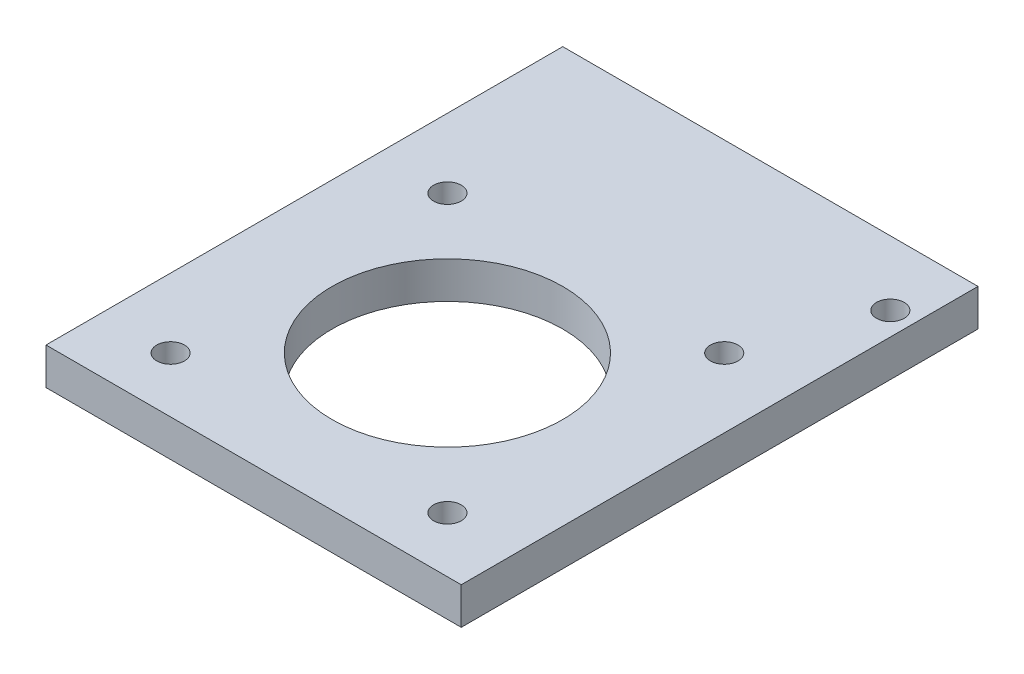
ISO-10303-21;
HEADER;
FILE_DESCRIPTION(('STEP AP214'),'2;1');
FILE_NAME('part.step','',(''),(''),'','','');
FILE_SCHEMA(('AUTOMOTIVE_DESIGN { 1 0 10303 214 1 1 1 1 }'));
ENDSEC;
DATA;
#1=APPLICATION_CONTEXT('core data for automotive mechanical design processes');
#2=APPLICATION_PROTOCOL_DEFINITION('international standard','automotive_design',2000,#1);
#3=PRODUCT_CONTEXT('',#1,'mechanical');
#4=PRODUCT('Part','Part','',(#3));
#5=PRODUCT_RELATED_PRODUCT_CATEGORY('part','',(#4));
#6=PRODUCT_DEFINITION_FORMATION('','',#4);
#7=PRODUCT_DEFINITION_CONTEXT('part definition',#1,'design');
#8=PRODUCT_DEFINITION('design','',#6,#7);
#9=PRODUCT_DEFINITION_SHAPE('','',#8);
#10=(LENGTH_UNIT() NAMED_UNIT(*) SI_UNIT(.MILLI.,.METRE.));
#11=(NAMED_UNIT(*) PLANE_ANGLE_UNIT() SI_UNIT($,.RADIAN.));
#12=(NAMED_UNIT(*) SI_UNIT($,.STERADIAN.) SOLID_ANGLE_UNIT());
#13=UNCERTAINTY_MEASURE_WITH_UNIT(LENGTH_MEASURE(1.E-05),#10,'distance_accuracy_value','');
#14=(GEOMETRIC_REPRESENTATION_CONTEXT(3) GLOBAL_UNCERTAINTY_ASSIGNED_CONTEXT((#13)) GLOBAL_UNIT_ASSIGNED_CONTEXT((#10,
#11,#12)) REPRESENTATION_CONTEXT('',''));
#15=CARTESIAN_POINT('',(0.,0.,0.));
#16=DIRECTION('',(0.,0.,1.));
#17=DIRECTION('',(1.,0.,0.));
#18=AXIS2_PLACEMENT_3D('',#15,#16,#17);
#19=CARTESIAN_POINT('',(22.5,4.,-28.));
#20=DIRECTION('',(-1.,0.,0.));
#21=DIRECTION('',(0.,0.,1.));
#22=AXIS2_PLACEMENT_3D('',#19,#20,#21);
#23=PLANE('',#22);
#24=DIRECTION('',(0.,0.,-1.));
#25=VECTOR('',#24,1.);
#26=CARTESIAN_POINT('',(22.5,0.,-28.));
#27=LINE('',#26,#25);
#28=CARTESIAN_POINT('',(22.5,0.,28.));
#29=VERTEX_POINT('',#28);
#30=CARTESIAN_POINT('',(22.5,0.,-28.));
#31=VERTEX_POINT('',#30);
#32=EDGE_CURVE('E97',#29,#31,#27,.T.);
#33=ORIENTED_EDGE('',*,*,#32,.T.);
#34=DIRECTION('',(0.,-1.,0.));
#35=VECTOR('',#34,1.);
#36=CARTESIAN_POINT('',(22.5,4.,-28.));
#37=LINE('',#36,#35);
#38=CARTESIAN_POINT('',(22.5,4.,-28.));
#39=VERTEX_POINT('',#38);
#40=EDGE_CURVE('E11',#39,#31,#37,.T.);
#41=ORIENTED_EDGE('',*,*,#40,.F.);
#42=DIRECTION('',(0.,0.,-1.));
#43=VECTOR('',#42,1.);
#44=CARTESIAN_POINT('',(22.5,4.,-28.));
#45=LINE('',#44,#43);
#46=CARTESIAN_POINT('',(22.5,4.,28.));
#47=VERTEX_POINT('',#46);
#48=EDGE_CURVE('E85',#47,#39,#45,.T.);
#49=ORIENTED_EDGE('',*,*,#48,.F.);
#50=DIRECTION('',(0.,-1.,0.));
#51=VECTOR('',#50,1.);
#52=CARTESIAN_POINT('',(22.5,4.,28.));
#53=LINE('',#52,#51);
#54=EDGE_CURVE('E93',#47,#29,#53,.T.);
#55=ORIENTED_EDGE('',*,*,#54,.T.);
#56=EDGE_LOOP('',(#33,#41,#49,#55));
#57=FACE_BOUND('',#56,.T.);
#58=ADVANCED_FACE('F34',(#57),#23,.F.);
#59=CARTESIAN_POINT('',(-22.5,4.,-28.));
#60=DIRECTION('',(0.,0.,1.));
#61=DIRECTION('',(1.,0.,0.));
#62=AXIS2_PLACEMENT_3D('',#59,#60,#61);
#63=PLANE('',#62);
#64=DIRECTION('',(-1.,0.,0.));
#65=VECTOR('',#64,1.);
#66=CARTESIAN_POINT('',(-22.5,0.,-28.));
#67=LINE('',#66,#65);
#68=CARTESIAN_POINT('',(-22.5,0.,-28.));
#69=VERTEX_POINT('',#68);
#70=EDGE_CURVE('E89',#31,#69,#67,.T.);
#71=ORIENTED_EDGE('',*,*,#70,.T.);
#72=DIRECTION('',(0.,-1.,0.));
#73=VECTOR('',#72,1.);
#74=CARTESIAN_POINT('',(-22.5,4.,-28.));
#75=LINE('',#74,#73);
#76=CARTESIAN_POINT('',(-22.5,4.,-28.));
#77=VERTEX_POINT('',#76);
#78=EDGE_CURVE('E42',#77,#69,#75,.T.);
#79=ORIENTED_EDGE('',*,*,#78,.F.);
#80=DIRECTION('',(-1.,0.,0.));
#81=VECTOR('',#80,1.);
#82=CARTESIAN_POINT('',(-22.5,4.,-28.));
#83=LINE('',#82,#81);
#84=EDGE_CURVE('E80',#39,#77,#83,.T.);
#85=ORIENTED_EDGE('',*,*,#84,.F.);
#86=ORIENTED_EDGE('',*,*,#40,.T.);
#87=EDGE_LOOP('',(#71,#79,#85,#86));
#88=FACE_BOUND('',#87,.T.);
#89=ADVANCED_FACE('F88',(#88),#63,.F.);
#90=CARTESIAN_POINT('',(-22.5,4.,-28.));
#91=DIRECTION('',(1.,0.,0.));
#92=DIRECTION('',(0.,0.,-1.));
#93=AXIS2_PLACEMENT_3D('',#90,#91,#92);
#94=PLANE('',#93);
#95=DIRECTION('',(0.,0.,1.));
#96=VECTOR('',#95,1.);
#97=CARTESIAN_POINT('',(-22.5,0.,-28.));
#98=LINE('',#97,#96);
#99=CARTESIAN_POINT('',(-22.5,0.,28.));
#100=VERTEX_POINT('',#99);
#101=EDGE_CURVE('E67',#69,#100,#98,.T.);
#102=ORIENTED_EDGE('',*,*,#101,.T.);
#103=DIRECTION('',(0.,-1.,0.));
#104=VECTOR('',#103,1.);
#105=CARTESIAN_POINT('',(-22.5,4.,28.));
#106=LINE('',#105,#104);
#107=CARTESIAN_POINT('',(-22.5,4.,28.));
#108=VERTEX_POINT('',#107);
#109=EDGE_CURVE('E90',#108,#100,#106,.T.);
#110=ORIENTED_EDGE('',*,*,#109,.F.);
#111=DIRECTION('',(0.,0.,1.));
#112=VECTOR('',#111,1.);
#113=CARTESIAN_POINT('',(-22.5,4.,-28.));
#114=LINE('',#113,#112);
#115=EDGE_CURVE('E83',#77,#108,#114,.T.);
#116=ORIENTED_EDGE('',*,*,#115,.F.);
#117=ORIENTED_EDGE('',*,*,#78,.T.);
#118=EDGE_LOOP('',(#102,#110,#116,#117));
#119=FACE_BOUND('',#118,.T.);
#120=ADVANCED_FACE('F91',(#119),#94,.F.);
#121=CARTESIAN_POINT('',(-22.5,4.,28.));
#122=DIRECTION('',(0.,0.,-1.));
#123=DIRECTION('',(-1.,0.,0.));
#124=AXIS2_PLACEMENT_3D('',#121,#122,#123);
#125=PLANE('',#124);
#126=DIRECTION('',(1.,0.,0.));
#127=VECTOR('',#126,1.);
#128=CARTESIAN_POINT('',(-22.5,0.,28.));
#129=LINE('',#128,#127);
#130=EDGE_CURVE('E73',#100,#29,#129,.T.);
#131=ORIENTED_EDGE('',*,*,#130,.T.);
#132=ORIENTED_EDGE('',*,*,#54,.F.);
#133=DIRECTION('',(1.,0.,0.));
#134=VECTOR('',#133,1.);
#135=CARTESIAN_POINT('',(-22.5,4.,28.));
#136=LINE('',#135,#134);
#137=EDGE_CURVE('E50',#108,#47,#136,.T.);
#138=ORIENTED_EDGE('',*,*,#137,.F.);
#139=ORIENTED_EDGE('',*,*,#109,.T.);
#140=EDGE_LOOP('',(#131,#132,#138,#139));
#141=FACE_BOUND('',#140,.T.);
#142=ADVANCED_FACE('F105',(#141),#125,.F.);
#143=CARTESIAN_POINT('',(0.,4.,0.));
#144=DIRECTION('',(0.,1.,0.));
#145=DIRECTION('',(0.,0.,1.));
#146=AXIS2_PLACEMENT_3D('',#143,#144,#145);
#147=PLANE('',#146);
#148=CARTESIAN_POINT('',(-15.,4.,22.));
#149=DIRECTION('',(0.,1.,0.));
#150=DIRECTION('',(0.,0.,1.));
#151=AXIS2_PLACEMENT_3D('',#148,#149,#150);
#152=CIRCLE('',#151,1.5);
#153=CARTESIAN_POINT('',(-15.,4.,23.5));
#154=VERTEX_POINT('',#153);
#155=EDGE_CURVE('E141',#154,#154,#152,.T.);
#156=ORIENTED_EDGE('',*,*,#155,.F.);
#157=EDGE_LOOP('',(#156));
#158=FACE_BOUND('',#157,.T.);
#159=CARTESIAN_POINT('',(15.,4.,22.));
#160=DIRECTION('',(0.,1.,0.));
#161=DIRECTION('',(0.,0.,1.));
#162=AXIS2_PLACEMENT_3D('',#159,#160,#161);
#163=CIRCLE('',#162,1.5);
#164=CARTESIAN_POINT('',(15.,4.,23.5));
#165=VERTEX_POINT('',#164);
#166=EDGE_CURVE('E124',#165,#165,#163,.T.);
#167=ORIENTED_EDGE('',*,*,#166,.F.);
#168=EDGE_LOOP('',(#167));
#169=FACE_BOUND('',#168,.T.);
#170=CARTESIAN_POINT('',(0.,4.,7.));
#171=DIRECTION('',(0.,1.,0.));
#172=DIRECTION('',(0.,0.,1.));
#173=AXIS2_PLACEMENT_3D('',#170,#171,#172);
#174=CIRCLE('',#173,12.5);
#175=CARTESIAN_POINT('',(0.,4.,19.5));
#176=VERTEX_POINT('',#175);
#177=EDGE_CURVE('E125',#176,#176,#174,.T.);
#178=ORIENTED_EDGE('',*,*,#177,.F.);
#179=EDGE_LOOP('',(#178));
#180=FACE_BOUND('',#179,.T.);
#181=CARTESIAN_POINT('',(20.,4.,-21.));
#182=DIRECTION('',(0.,1.,0.));
#183=DIRECTION('',(0.,0.,1.));
#184=AXIS2_PLACEMENT_3D('',#181,#182,#183);
#185=CIRCLE('',#184,1.5);
#186=CARTESIAN_POINT('',(20.,4.,-19.5));
#187=VERTEX_POINT('',#186);
#188=EDGE_CURVE('E131',#187,#187,#185,.T.);
#189=ORIENTED_EDGE('',*,*,#188,.F.);
#190=EDGE_LOOP('',(#189));
#191=FACE_BOUND('',#190,.T.);
#192=CARTESIAN_POINT('',(15.,4.,-8.));
#193=DIRECTION('',(0.,1.,0.));
#194=DIRECTION('',(0.,0.,1.));
#195=AXIS2_PLACEMENT_3D('',#192,#193,#194);
#196=CIRCLE('',#195,1.5);
#197=CARTESIAN_POINT('',(15.,4.,-6.5));
#198=VERTEX_POINT('',#197);
#199=EDGE_CURVE('E117',#198,#198,#196,.T.);
#200=ORIENTED_EDGE('',*,*,#199,.F.);
#201=EDGE_LOOP('',(#200));
#202=FACE_BOUND('',#201,.T.);
#203=CARTESIAN_POINT('',(-15.,4.,-8.));
#204=DIRECTION('',(0.,1.,0.));
#205=DIRECTION('',(0.,0.,1.));
#206=AXIS2_PLACEMENT_3D('',#203,#204,#205);
#207=CIRCLE('',#206,1.5);
#208=CARTESIAN_POINT('',(-15.,4.,-6.5));
#209=VERTEX_POINT('',#208);
#210=EDGE_CURVE('E111',#209,#209,#207,.T.);
#211=ORIENTED_EDGE('',*,*,#210,.F.);
#212=EDGE_LOOP('',(#211));
#213=FACE_BOUND('',#212,.T.);
#214=ORIENTED_EDGE('',*,*,#48,.T.);
#215=ORIENTED_EDGE('',*,*,#84,.T.);
#216=ORIENTED_EDGE('',*,*,#115,.T.);
#217=ORIENTED_EDGE('',*,*,#137,.T.);
#218=EDGE_LOOP('',(#214,#215,#216,#217));
#219=FACE_BOUND('',#218,.T.);
#220=ADVANCED_FACE('F81',(#158,#169,#180,#191,#202,#213,#219),#147,.T.);
#221=CARTESIAN_POINT('',(0.,0.,0.));
#222=DIRECTION('',(0.,1.,0.));
#223=DIRECTION('',(0.,0.,1.));
#224=AXIS2_PLACEMENT_3D('',#221,#222,#223);
#225=PLANE('',#224);
#226=CARTESIAN_POINT('',(-15.,0.,22.));
#227=DIRECTION('',(0.,1.,0.));
#228=DIRECTION('',(0.,0.,1.));
#229=AXIS2_PLACEMENT_3D('',#226,#227,#228);
#230=CIRCLE('',#229,1.5);
#231=CARTESIAN_POINT('',(-15.,0.,23.5));
#232=VERTEX_POINT('',#231);
#233=EDGE_CURVE('E114',#232,#232,#230,.T.);
#234=ORIENTED_EDGE('',*,*,#233,.T.);
#235=EDGE_LOOP('',(#234));
#236=FACE_BOUND('',#235,.T.);
#237=CARTESIAN_POINT('',(15.,0.,22.));
#238=DIRECTION('',(0.,1.,0.));
#239=DIRECTION('',(0.,0.,1.));
#240=AXIS2_PLACEMENT_3D('',#237,#238,#239);
#241=CIRCLE('',#240,1.5);
#242=CARTESIAN_POINT('',(15.,0.,23.5));
#243=VERTEX_POINT('',#242);
#244=EDGE_CURVE('E138',#243,#243,#241,.T.);
#245=ORIENTED_EDGE('',*,*,#244,.T.);
#246=EDGE_LOOP('',(#245));
#247=FACE_BOUND('',#246,.T.);
#248=CARTESIAN_POINT('',(0.,0.,7.));
#249=DIRECTION('',(0.,1.,0.));
#250=DIRECTION('',(0.,0.,1.));
#251=AXIS2_PLACEMENT_3D('',#248,#249,#250);
#252=CIRCLE('',#251,12.5);
#253=CARTESIAN_POINT('',(0.,0.,19.5));
#254=VERTEX_POINT('',#253);
#255=EDGE_CURVE('E128',#254,#254,#252,.T.);
#256=ORIENTED_EDGE('',*,*,#255,.T.);
#257=EDGE_LOOP('',(#256));
#258=FACE_BOUND('',#257,.T.);
#259=CARTESIAN_POINT('',(20.,0.,-21.));
#260=DIRECTION('',(0.,1.,0.));
#261=DIRECTION('',(0.,0.,1.));
#262=AXIS2_PLACEMENT_3D('',#259,#260,#261);
#263=CIRCLE('',#262,1.5);
#264=CARTESIAN_POINT('',(20.,0.,-19.5));
#265=VERTEX_POINT('',#264);
#266=EDGE_CURVE('E121',#265,#265,#263,.T.);
#267=ORIENTED_EDGE('',*,*,#266,.T.);
#268=EDGE_LOOP('',(#267));
#269=FACE_BOUND('',#268,.T.);
#270=CARTESIAN_POINT('',(15.,0.,-8.));
#271=DIRECTION('',(0.,1.,0.));
#272=DIRECTION('',(0.,0.,1.));
#273=AXIS2_PLACEMENT_3D('',#270,#271,#272);
#274=CIRCLE('',#273,1.5);
#275=CARTESIAN_POINT('',(15.,0.,-6.5));
#276=VERTEX_POINT('',#275);
#277=EDGE_CURVE('E120',#276,#276,#274,.T.);
#278=ORIENTED_EDGE('',*,*,#277,.T.);
#279=EDGE_LOOP('',(#278));
#280=FACE_BOUND('',#279,.T.);
#281=CARTESIAN_POINT('',(-15.,0.,-8.));
#282=DIRECTION('',(0.,1.,0.));
#283=DIRECTION('',(0.,0.,1.));
#284=AXIS2_PLACEMENT_3D('',#281,#282,#283);
#285=CIRCLE('',#284,1.5);
#286=CARTESIAN_POINT('',(-15.,0.,-6.5));
#287=VERTEX_POINT('',#286);
#288=EDGE_CURVE('E100',#287,#287,#285,.T.);
#289=ORIENTED_EDGE('',*,*,#288,.T.);
#290=EDGE_LOOP('',(#289));
#291=FACE_BOUND('',#290,.T.);
#292=ORIENTED_EDGE('',*,*,#32,.F.);
#293=ORIENTED_EDGE('',*,*,#130,.F.);
#294=ORIENTED_EDGE('',*,*,#101,.F.);
#295=ORIENTED_EDGE('',*,*,#70,.F.);
#296=EDGE_LOOP('',(#292,#293,#294,#295));
#297=FACE_BOUND('',#296,.T.);
#298=ADVANCED_FACE('F108',(#236,#247,#258,#269,#280,#291,#297),#225,.F.);
#299=CARTESIAN_POINT('',(-15.,0.,-8.));
#300=DIRECTION('',(0.,1.,0.));
#301=DIRECTION('',(0.,0.,1.));
#302=AXIS2_PLACEMENT_3D('',#299,#300,#301);
#303=CYLINDRICAL_SURFACE('',#302,1.5);
#304=ORIENTED_EDGE('',*,*,#288,.F.);
#305=EDGE_LOOP('',(#304));
#306=FACE_BOUND('',#305,.T.);
#307=ORIENTED_EDGE('',*,*,#210,.T.);
#308=EDGE_LOOP('',(#307));
#309=FACE_BOUND('',#308,.T.);
#310=ADVANCED_FACE('F169',(#306,#309),#303,.F.);
#311=CARTESIAN_POINT('',(15.,0.,-8.));
#312=DIRECTION('',(0.,1.,0.));
#313=DIRECTION('',(0.,0.,1.));
#314=AXIS2_PLACEMENT_3D('',#311,#312,#313);
#315=CYLINDRICAL_SURFACE('',#314,1.5);
#316=ORIENTED_EDGE('',*,*,#277,.F.);
#317=EDGE_LOOP('',(#316));
#318=FACE_BOUND('',#317,.T.);
#319=ORIENTED_EDGE('',*,*,#199,.T.);
#320=EDGE_LOOP('',(#319));
#321=FACE_BOUND('',#320,.T.);
#322=ADVANCED_FACE('F171',(#318,#321),#315,.F.);
#323=CARTESIAN_POINT('',(20.,0.,-21.));
#324=DIRECTION('',(0.,1.,0.));
#325=DIRECTION('',(0.,0.,1.));
#326=AXIS2_PLACEMENT_3D('',#323,#324,#325);
#327=CYLINDRICAL_SURFACE('',#326,1.5);
#328=ORIENTED_EDGE('',*,*,#266,.F.);
#329=EDGE_LOOP('',(#328));
#330=FACE_BOUND('',#329,.T.);
#331=ORIENTED_EDGE('',*,*,#188,.T.);
#332=EDGE_LOOP('',(#331));
#333=FACE_BOUND('',#332,.T.);
#334=ADVANCED_FACE('F178',(#330,#333),#327,.F.);
#335=CARTESIAN_POINT('',(0.,0.,7.));
#336=DIRECTION('',(0.,1.,0.));
#337=DIRECTION('',(0.,0.,1.));
#338=AXIS2_PLACEMENT_3D('',#335,#336,#337);
#339=CYLINDRICAL_SURFACE('',#338,12.5);
#340=ORIENTED_EDGE('',*,*,#255,.F.);
#341=EDGE_LOOP('',(#340));
#342=FACE_BOUND('',#341,.T.);
#343=ORIENTED_EDGE('',*,*,#177,.T.);
#344=EDGE_LOOP('',(#343));
#345=FACE_BOUND('',#344,.T.);
#346=ADVANCED_FACE('F224',(#342,#345),#339,.F.);
#347=CARTESIAN_POINT('',(15.,0.,22.));
#348=DIRECTION('',(0.,1.,0.));
#349=DIRECTION('',(0.,0.,1.));
#350=AXIS2_PLACEMENT_3D('',#347,#348,#349);
#351=CYLINDRICAL_SURFACE('',#350,1.5);
#352=ORIENTED_EDGE('',*,*,#244,.F.);
#353=EDGE_LOOP('',(#352));
#354=FACE_BOUND('',#353,.T.);
#355=ORIENTED_EDGE('',*,*,#166,.T.);
#356=EDGE_LOOP('',(#355));
#357=FACE_BOUND('',#356,.T.);
#358=ADVANCED_FACE('F152',(#354,#357),#351,.F.);
#359=CARTESIAN_POINT('',(-15.,0.,22.));
#360=DIRECTION('',(0.,1.,0.));
#361=DIRECTION('',(0.,0.,1.));
#362=AXIS2_PLACEMENT_3D('',#359,#360,#361);
#363=CYLINDRICAL_SURFACE('',#362,1.5);
#364=ORIENTED_EDGE('',*,*,#233,.F.);
#365=EDGE_LOOP('',(#364));
#366=FACE_BOUND('',#365,.T.);
#367=ORIENTED_EDGE('',*,*,#155,.T.);
#368=EDGE_LOOP('',(#367));
#369=FACE_BOUND('',#368,.T.);
#370=ADVANCED_FACE('F149',(#366,#369),#363,.F.);
#371=CLOSED_SHELL('',(#58,#89,#120,#142,#220,#298,#310,#322,#334,#346,#358,#370));
#372=MANIFOLD_SOLID_BREP('B2',#371);
#373=ADVANCED_BREP_SHAPE_REPRESENTATION('',(#18,#372),#14);
#374=SHAPE_DEFINITION_REPRESENTATION(#9,#373);
ENDSEC;
END-ISO-10303-21;
